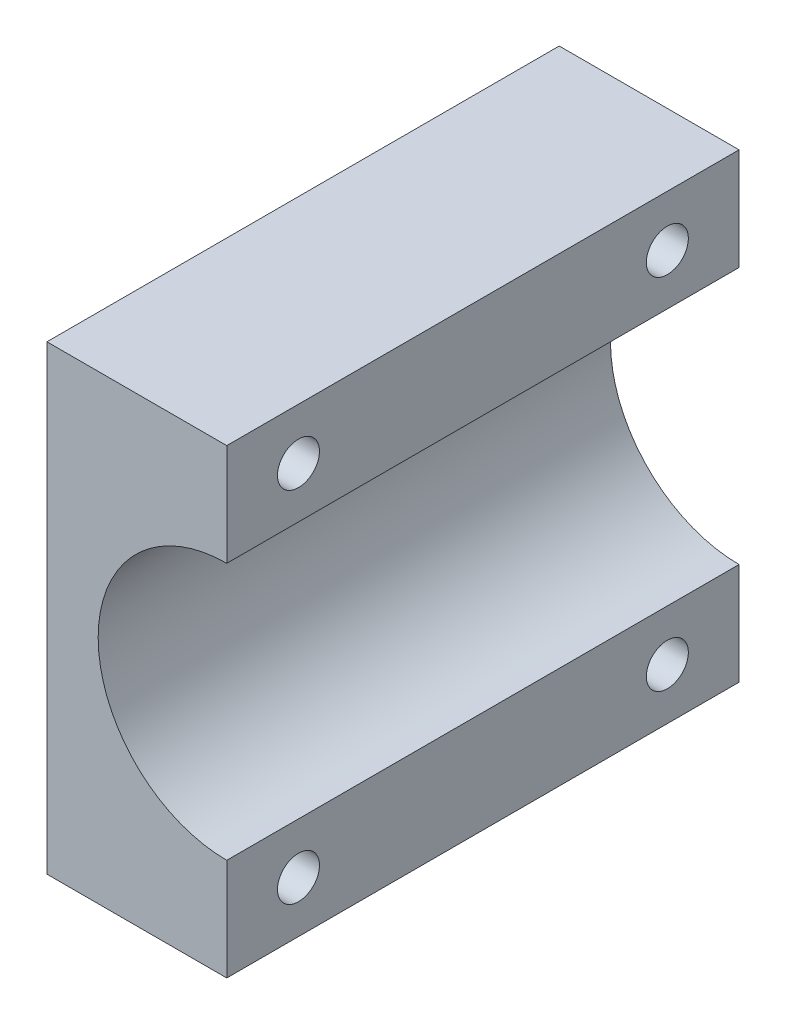
ISO-10303-21;
HEADER;
FILE_DESCRIPTION(('STEP AP214'),'2;1');
FILE_NAME('part.step','',(''),(''),'','','');
FILE_SCHEMA(('AUTOMOTIVE_DESIGN { 1 0 10303 214 1 1 1 1 }'));
ENDSEC;
DATA;
#1=APPLICATION_CONTEXT('core data for automotive mechanical design processes');
#2=APPLICATION_PROTOCOL_DEFINITION('international standard','automotive_design',2000,#1);
#3=PRODUCT_CONTEXT('',#1,'mechanical');
#4=PRODUCT('Part','Part','',(#3));
#5=PRODUCT_RELATED_PRODUCT_CATEGORY('part','',(#4));
#6=PRODUCT_DEFINITION_FORMATION('','',#4);
#7=PRODUCT_DEFINITION_CONTEXT('part definition',#1,'design');
#8=PRODUCT_DEFINITION('design','',#6,#7);
#9=PRODUCT_DEFINITION_SHAPE('','',#8);
#10=(LENGTH_UNIT() NAMED_UNIT(*) SI_UNIT(.MILLI.,.METRE.));
#11=(NAMED_UNIT(*) PLANE_ANGLE_UNIT() SI_UNIT($,.RADIAN.));
#12=(NAMED_UNIT(*) SI_UNIT($,.STERADIAN.) SOLID_ANGLE_UNIT());
#13=UNCERTAINTY_MEASURE_WITH_UNIT(LENGTH_MEASURE(1.E-05),#10,'distance_accuracy_value','');
#14=(GEOMETRIC_REPRESENTATION_CONTEXT(3) GLOBAL_UNCERTAINTY_ASSIGNED_CONTEXT((#13)) GLOBAL_UNIT_ASSIGNED_CONTEXT((#10,
#11,#12)) REPRESENTATION_CONTEXT('',''));
#15=CARTESIAN_POINT('',(0.,0.,0.));
#16=DIRECTION('',(0.,0.,1.));
#17=DIRECTION('',(1.,0.,0.));
#18=AXIS2_PLACEMENT_3D('',#15,#16,#17);
#19=CARTESIAN_POINT('',(-17.55,22.5,25.));
#20=DIRECTION('',(1.,0.,0.));
#21=DIRECTION('',(0.,1.,0.));
#22=AXIS2_PLACEMENT_3D('',#19,#20,#21);
#23=PLANE('',#22);
#24=CARTESIAN_POINT('',(-17.55,40.,-18.));
#25=DIRECTION('',(1.,0.,0.));
#26=DIRECTION('',(0.,0.,1.));
#27=AXIS2_PLACEMENT_3D('',#24,#25,#26);
#28=CIRCLE('',#27,2.05);
#29=CARTESIAN_POINT('',(-17.55,40.,-15.95));
#30=VERTEX_POINT('',#29);
#31=EDGE_CURVE('E132',#30,#30,#28,.T.);
#32=ORIENTED_EDGE('',*,*,#31,.T.);
#33=EDGE_LOOP('',(#32));
#34=FACE_BOUND('',#33,.T.);
#35=CARTESIAN_POINT('',(-17.55,40.,18.));
#36=DIRECTION('',(1.,0.,0.));
#37=DIRECTION('',(0.,0.,1.));
#38=AXIS2_PLACEMENT_3D('',#35,#36,#37);
#39=CIRCLE('',#38,2.05);
#40=CARTESIAN_POINT('',(-17.55,40.,20.05));
#41=VERTEX_POINT('',#40);
#42=EDGE_CURVE('E135',#41,#41,#39,.T.);
#43=ORIENTED_EDGE('',*,*,#42,.T.);
#44=EDGE_LOOP('',(#43));
#45=FACE_BOUND('',#44,.T.);
#46=CARTESIAN_POINT('',(-17.55,5.,-18.));
#47=DIRECTION('',(-1.,0.,0.));
#48=DIRECTION('',(0.,0.,1.));
#49=AXIS2_PLACEMENT_3D('',#46,#47,#48);
#50=CIRCLE('',#49,2.05);
#51=CARTESIAN_POINT('',(-17.55,5.,-15.95));
#52=VERTEX_POINT('',#51);
#53=EDGE_CURVE('E117',#52,#52,#50,.T.);
#54=ORIENTED_EDGE('',*,*,#53,.F.);
#55=EDGE_LOOP('',(#54));
#56=FACE_BOUND('',#55,.T.);
#57=CARTESIAN_POINT('',(-17.55,5.,18.));
#58=DIRECTION('',(-1.,0.,0.));
#59=DIRECTION('',(0.,0.,1.));
#60=AXIS2_PLACEMENT_3D('',#57,#58,#59);
#61=CIRCLE('',#60,2.05);
#62=CARTESIAN_POINT('',(-17.55,5.,20.05));
#63=VERTEX_POINT('',#62);
#64=EDGE_CURVE('E121',#63,#63,#61,.T.);
#65=ORIENTED_EDGE('',*,*,#64,.F.);
#66=EDGE_LOOP('',(#65));
#67=FACE_BOUND('',#66,.T.);
#68=DIRECTION('',(0.,-1.,0.));
#69=VECTOR('',#68,1.);
#70=CARTESIAN_POINT('',(-17.55,22.5,-25.));
#71=LINE('',#70,#69);
#72=CARTESIAN_POINT('',(-17.55,45.,-25.));
#73=VERTEX_POINT('',#72);
#74=CARTESIAN_POINT('',(-17.55,0.,-25.));
#75=VERTEX_POINT('',#74);
#76=EDGE_CURVE('E113',#73,#75,#71,.T.);
#77=ORIENTED_EDGE('',*,*,#76,.T.);
#78=DIRECTION('',(0.,0.,-1.));
#79=VECTOR('',#78,1.);
#80=CARTESIAN_POINT('',(-17.55,0.,25.));
#81=LINE('',#80,#79);
#82=CARTESIAN_POINT('',(-17.55,0.,25.));
#83=VERTEX_POINT('',#82);
#84=EDGE_CURVE('E11',#83,#75,#81,.T.);
#85=ORIENTED_EDGE('',*,*,#84,.F.);
#86=DIRECTION('',(0.,-1.,0.));
#87=VECTOR('',#86,1.);
#88=CARTESIAN_POINT('',(-17.55,22.5,25.));
#89=LINE('',#88,#87);
#90=CARTESIAN_POINT('',(-17.55,45.,25.));
#91=VERTEX_POINT('',#90);
#92=EDGE_CURVE('E108',#91,#83,#89,.T.);
#93=ORIENTED_EDGE('',*,*,#92,.F.);
#94=DIRECTION('',(0.,0.,-1.));
#95=VECTOR('',#94,1.);
#96=CARTESIAN_POINT('',(-17.55,45.,25.));
#97=LINE('',#96,#95);
#98=EDGE_CURVE('E124',#91,#73,#97,.T.);
#99=ORIENTED_EDGE('',*,*,#98,.T.);
#100=EDGE_LOOP('',(#77,#85,#93,#99));
#101=FACE_BOUND('',#100,.T.);
#102=ADVANCED_FACE('F35',(#34,#45,#56,#67,#101),#23,.F.);
#103=CARTESIAN_POINT('',(-17.55,0.,25.));
#104=DIRECTION('',(0.,1.,0.));
#105=DIRECTION('',(0.,0.,1.));
#106=AXIS2_PLACEMENT_3D('',#103,#104,#105);
#107=PLANE('',#106);
#108=DIRECTION('',(1.,0.,0.));
#109=VECTOR('',#108,1.);
#110=CARTESIAN_POINT('',(-17.55,0.,-25.));
#111=LINE('',#110,#109);
#112=CARTESIAN_POINT('',(0.,0.,-25.));
#113=VERTEX_POINT('',#112);
#114=EDGE_CURVE('E109',#75,#113,#111,.T.);
#115=ORIENTED_EDGE('',*,*,#114,.T.);
#116=DIRECTION('',(0.,0.,-1.));
#117=VECTOR('',#116,1.);
#118=CARTESIAN_POINT('',(0.,0.,-25.));
#119=LINE('',#118,#117);
#120=CARTESIAN_POINT('',(0.,0.,25.));
#121=VERTEX_POINT('',#120);
#122=EDGE_CURVE('E50',#121,#113,#119,.T.);
#123=ORIENTED_EDGE('',*,*,#122,.F.);
#124=DIRECTION('',(1.,0.,0.));
#125=VECTOR('',#124,1.);
#126=CARTESIAN_POINT('',(-17.55,0.,25.));
#127=LINE('',#126,#125);
#128=EDGE_CURVE('E111',#83,#121,#127,.T.);
#129=ORIENTED_EDGE('',*,*,#128,.F.);
#130=ORIENTED_EDGE('',*,*,#84,.T.);
#131=EDGE_LOOP('',(#115,#123,#129,#130));
#132=FACE_BOUND('',#131,.T.);
#133=ADVANCED_FACE('F167',(#132),#107,.F.);
#134=CARTESIAN_POINT('',(0.,22.5,25.));
#135=DIRECTION('',(0.,0.,-1.));
#136=DIRECTION('',(-1.,0.,0.));
#137=AXIS2_PLACEMENT_3D('',#134,#135,#136);
#138=CYLINDRICAL_SURFACE('',#137,12.55);
#139=CARTESIAN_POINT('',(0.,22.5,-25.));
#140=DIRECTION('',(0.,0.,-1.));
#141=DIRECTION('',(1.,0.,0.));
#142=AXIS2_PLACEMENT_3D('',#139,#140,#141);
#143=CIRCLE('',#142,12.55);
#144=CARTESIAN_POINT('',(0.,9.95000000000002,-25.));
#145=VERTEX_POINT('',#144);
#146=CARTESIAN_POINT('',(0.,35.05,-25.));
#147=VERTEX_POINT('',#146);
#148=EDGE_CURVE('E101',#145,#147,#143,.T.);
#149=ORIENTED_EDGE('',*,*,#148,.T.);
#150=DIRECTION('',(0.,0.,-1.));
#151=VECTOR('',#150,1.);
#152=CARTESIAN_POINT('',(0.,35.05,25.));
#153=LINE('',#152,#151);
#154=CARTESIAN_POINT('',(0.,35.05,25.));
#155=VERTEX_POINT('',#154);
#156=EDGE_CURVE('E138',#147,#155,#153,.F.);
#157=ORIENTED_EDGE('',*,*,#156,.T.);
#158=CARTESIAN_POINT('',(0.,22.5,25.));
#159=DIRECTION('',(0.,0.,-1.));
#160=DIRECTION('',(1.,0.,0.));
#161=AXIS2_PLACEMENT_3D('',#158,#159,#160);
#162=CIRCLE('',#161,12.55);
#163=CARTESIAN_POINT('',(0.,9.95000000000001,25.));
#164=VERTEX_POINT('',#163);
#165=EDGE_CURVE('E43',#164,#155,#162,.T.);
#166=ORIENTED_EDGE('',*,*,#165,.F.);
#167=DIRECTION('',(0.,0.,-1.));
#168=VECTOR('',#167,1.);
#169=CARTESIAN_POINT('',(0.,9.95000000000001,25.));
#170=LINE('',#169,#168);
#171=EDGE_CURVE('E88',#164,#145,#170,.T.);
#172=ORIENTED_EDGE('',*,*,#171,.T.);
#173=EDGE_LOOP('',(#149,#157,#166,#172));
#174=FACE_BOUND('',#173,.T.);
#175=ADVANCED_FACE('F99',(#174),#138,.F.);
#176=CARTESIAN_POINT('',(0.,22.5,25.));
#177=DIRECTION('',(0.,0.,1.));
#178=DIRECTION('',(1.,0.,0.));
#179=AXIS2_PLACEMENT_3D('',#176,#177,#178);
#180=PLANE('',#179);
#181=DIRECTION('',(0.,-1.,0.));
#182=VECTOR('',#181,1.);
#183=CARTESIAN_POINT('',(0.,22.5,25.));
#184=LINE('',#183,#182);
#185=CARTESIAN_POINT('',(0.,45.,25.));
#186=VERTEX_POINT('',#185);
#187=EDGE_CURVE('E103',#186,#155,#184,.T.);
#188=ORIENTED_EDGE('',*,*,#187,.F.);
#189=DIRECTION('',(1.,0.,0.));
#190=VECTOR('',#189,1.);
#191=CARTESIAN_POINT('',(-17.55,45.,25.));
#192=LINE('',#191,#190);
#193=EDGE_CURVE('E129',#91,#186,#192,.T.);
#194=ORIENTED_EDGE('',*,*,#193,.F.);
#195=ORIENTED_EDGE('',*,*,#92,.T.);
#196=ORIENTED_EDGE('',*,*,#128,.T.);
#197=EDGE_CURVE('E104',#164,#121,#184,.T.);
#198=ORIENTED_EDGE('',*,*,#197,.F.);
#199=ORIENTED_EDGE('',*,*,#165,.T.);
#200=EDGE_LOOP('',(#188,#194,#195,#196,#198,#199));
#201=FACE_BOUND('',#200,.T.);
#202=ADVANCED_FACE('F181',(#201),#180,.T.);
#203=CARTESIAN_POINT('',(0.,22.5,-25.));
#204=DIRECTION('',(0.,0.,1.));
#205=DIRECTION('',(1.,0.,0.));
#206=AXIS2_PLACEMENT_3D('',#203,#204,#205);
#207=PLANE('',#206);
#208=DIRECTION('',(1.,0.,0.));
#209=VECTOR('',#208,1.);
#210=CARTESIAN_POINT('',(-17.55,45.,-25.));
#211=LINE('',#210,#209);
#212=CARTESIAN_POINT('',(0.,45.,-25.));
#213=VERTEX_POINT('',#212);
#214=EDGE_CURVE('E130',#73,#213,#211,.T.);
#215=ORIENTED_EDGE('',*,*,#214,.T.);
#216=DIRECTION('',(0.,1.,0.));
#217=VECTOR('',#216,1.);
#218=CARTESIAN_POINT('',(0.,45.,-25.));
#219=LINE('',#218,#217);
#220=EDGE_CURVE('E58',#147,#213,#219,.T.);
#221=ORIENTED_EDGE('',*,*,#220,.F.);
#222=ORIENTED_EDGE('',*,*,#148,.F.);
#223=EDGE_CURVE('E85',#113,#145,#219,.T.);
#224=ORIENTED_EDGE('',*,*,#223,.F.);
#225=ORIENTED_EDGE('',*,*,#114,.F.);
#226=ORIENTED_EDGE('',*,*,#76,.F.);
#227=EDGE_LOOP('',(#215,#221,#222,#224,#225,#226));
#228=FACE_BOUND('',#227,.T.);
#229=ADVANCED_FACE('F107',(#228),#207,.F.);
#230=CARTESIAN_POINT('',(23.3482756057297,5.,18.));
#231=DIRECTION('',(-1.,0.,0.));
#232=DIRECTION('',(0.,0.,1.));
#233=AXIS2_PLACEMENT_3D('',#230,#231,#232);
#234=CYLINDRICAL_SURFACE('',#233,2.05);
#235=CARTESIAN_POINT('',(0.,5.,18.));
#236=DIRECTION('',(-1.,0.,0.));
#237=DIRECTION('',(0.,0.,1.));
#238=AXIS2_PLACEMENT_3D('',#235,#236,#237);
#239=CIRCLE('',#238,2.05);
#240=CARTESIAN_POINT('',(0.,5.,20.05));
#241=VERTEX_POINT('',#240);
#242=EDGE_CURVE('E143',#241,#241,#239,.F.);
#243=ORIENTED_EDGE('',*,*,#242,.T.);
#244=EDGE_LOOP('',(#243));
#245=FACE_BOUND('',#244,.T.);
#246=ORIENTED_EDGE('',*,*,#64,.T.);
#247=EDGE_LOOP('',(#246));
#248=FACE_BOUND('',#247,.T.);
#249=ADVANCED_FACE('F201',(#245,#248),#234,.F.);
#250=CARTESIAN_POINT('',(23.3482756057297,5.,-18.));
#251=DIRECTION('',(-1.,0.,0.));
#252=DIRECTION('',(0.,0.,1.));
#253=AXIS2_PLACEMENT_3D('',#250,#251,#252);
#254=CYLINDRICAL_SURFACE('',#253,2.05);
#255=CARTESIAN_POINT('',(0.,5.,-18.));
#256=DIRECTION('',(-1.,0.,0.));
#257=DIRECTION('',(0.,0.,1.));
#258=AXIS2_PLACEMENT_3D('',#255,#256,#257);
#259=CIRCLE('',#258,2.05);
#260=CARTESIAN_POINT('',(0.,5.,-15.95));
#261=VERTEX_POINT('',#260);
#262=EDGE_CURVE('E146',#261,#261,#259,.F.);
#263=ORIENTED_EDGE('',*,*,#262,.T.);
#264=EDGE_LOOP('',(#263));
#265=FACE_BOUND('',#264,.T.);
#266=ORIENTED_EDGE('',*,*,#53,.T.);
#267=EDGE_LOOP('',(#266));
#268=FACE_BOUND('',#267,.T.);
#269=ADVANCED_FACE('F198',(#265,#268),#254,.F.);
#270=CARTESIAN_POINT('',(-17.55,45.,25.));
#271=DIRECTION('',(0.,1.,0.));
#272=DIRECTION('',(0.,0.,1.));
#273=AXIS2_PLACEMENT_3D('',#270,#271,#272);
#274=PLANE('',#273);
#275=DIRECTION('',(0.,0.,1.));
#276=VECTOR('',#275,1.);
#277=CARTESIAN_POINT('',(0.,45.,-25.));
#278=LINE('',#277,#276);
#279=EDGE_CURVE('E94',#213,#186,#278,.T.);
#280=ORIENTED_EDGE('',*,*,#279,.F.);
#281=ORIENTED_EDGE('',*,*,#214,.F.);
#282=ORIENTED_EDGE('',*,*,#98,.F.);
#283=ORIENTED_EDGE('',*,*,#193,.T.);
#284=EDGE_LOOP('',(#280,#281,#282,#283));
#285=FACE_BOUND('',#284,.T.);
#286=ADVANCED_FACE('F184',(#285),#274,.T.);
#287=CARTESIAN_POINT('',(23.3482756057297,40.,18.));
#288=DIRECTION('',(-1.,0.,0.));
#289=DIRECTION('',(0.,0.,1.));
#290=AXIS2_PLACEMENT_3D('',#287,#288,#289);
#291=CYLINDRICAL_SURFACE('',#290,2.05);
#292=CARTESIAN_POINT('',(0.,40.,18.));
#293=DIRECTION('',(-1.,0.,0.));
#294=DIRECTION('',(0.,0.,1.));
#295=AXIS2_PLACEMENT_3D('',#292,#293,#294);
#296=CIRCLE('',#295,2.05);
#297=CARTESIAN_POINT('',(0.,40.,20.05));
#298=VERTEX_POINT('',#297);
#299=EDGE_CURVE('E149',#298,#298,#296,.T.);
#300=CARTESIAN_POINT('',(0.,40.,20.05));
#301=CARTESIAN_POINT('',(-0.182812499999996,40.,20.05));
#302=CARTESIAN_POINT('',(-0.365624999999996,40.,20.05));
#303=CARTESIAN_POINT('',(-0.731249999999996,40.,20.05));
#304=CARTESIAN_POINT('',(-0.914062499999996,40.,20.05));
#305=CARTESIAN_POINT('',(-1.2796875,40.,20.05));
#306=CARTESIAN_POINT('',(-1.4625,40.,20.05));
#307=CARTESIAN_POINT('',(-1.828125,40.,20.05));
#308=CARTESIAN_POINT('',(-2.0109375,40.,20.05));
#309=CARTESIAN_POINT('',(-2.3765625,40.,20.05));
#310=CARTESIAN_POINT('',(-2.559375,40.,20.05));
#311=CARTESIAN_POINT('',(-2.925,40.,20.05));
#312=CARTESIAN_POINT('',(-3.1078125,40.,20.05));
#313=CARTESIAN_POINT('',(-3.4734375,40.,20.05));
#314=CARTESIAN_POINT('',(-3.65625,40.,20.05));
#315=CARTESIAN_POINT('',(-4.021875,40.,20.05));
#316=CARTESIAN_POINT('',(-4.2046875,40.,20.05));
#317=CARTESIAN_POINT('',(-4.5703125,40.,20.05));
#318=CARTESIAN_POINT('',(-4.753125,40.,20.05));
#319=CARTESIAN_POINT('',(-5.11875,40.,20.05));
#320=CARTESIAN_POINT('',(-5.3015625,40.,20.05));
#321=CARTESIAN_POINT('',(-5.6671875,40.,20.05));
#322=CARTESIAN_POINT('',(-5.85,40.,20.05));
#323=CARTESIAN_POINT('',(-6.215625,40.,20.05));
#324=CARTESIAN_POINT('',(-6.3984375,40.,20.05));
#325=CARTESIAN_POINT('',(-6.7640625,40.,20.05));
#326=CARTESIAN_POINT('',(-6.946875,40.,20.05));
#327=CARTESIAN_POINT('',(-7.3125,40.,20.05));
#328=CARTESIAN_POINT('',(-7.4953125,40.,20.05));
#329=CARTESIAN_POINT('',(-7.8609375,40.,20.05));
#330=CARTESIAN_POINT('',(-8.04374999999999,40.,20.05));
#331=CARTESIAN_POINT('',(-8.40937499999999,40.,20.05));
#332=CARTESIAN_POINT('',(-8.59218749999999,40.,20.05));
#333=CARTESIAN_POINT('',(-8.95781249999999,40.,20.05));
#334=CARTESIAN_POINT('',(-9.14062499999999,40.,20.05));
#335=CARTESIAN_POINT('',(-9.50625,40.,20.05));
#336=CARTESIAN_POINT('',(-9.6890625,40.,20.05));
#337=CARTESIAN_POINT('',(-10.0546875,40.,20.05));
#338=CARTESIAN_POINT('',(-10.2375,40.,20.05));
#339=CARTESIAN_POINT('',(-10.603125,40.,20.05));
#340=CARTESIAN_POINT('',(-10.7859375,40.,20.05));
#341=CARTESIAN_POINT('',(-11.1515625,40.,20.05));
#342=CARTESIAN_POINT('',(-11.334375,40.,20.05));
#343=CARTESIAN_POINT('',(-11.7,40.,20.05));
#344=CARTESIAN_POINT('',(-11.8828125,40.,20.05));
#345=CARTESIAN_POINT('',(-12.2484375,40.,20.05));
#346=CARTESIAN_POINT('',(-12.43125,40.,20.05));
#347=CARTESIAN_POINT('',(-12.796875,40.,20.05));
#348=CARTESIAN_POINT('',(-12.9796875,40.,20.05));
#349=CARTESIAN_POINT('',(-13.3453125,40.,20.05));
#350=CARTESIAN_POINT('',(-13.528125,40.,20.05));
#351=CARTESIAN_POINT('',(-13.89375,40.,20.05));
#352=CARTESIAN_POINT('',(-14.0765625,40.,20.05));
#353=CARTESIAN_POINT('',(-14.4421875,40.,20.05));
#354=CARTESIAN_POINT('',(-14.625,40.,20.05));
#355=CARTESIAN_POINT('',(-14.990625,40.,20.05));
#356=CARTESIAN_POINT('',(-15.1734375,40.,20.05));
#357=CARTESIAN_POINT('',(-15.5390625,40.,20.05));
#358=CARTESIAN_POINT('',(-15.721875,40.,20.05));
#359=CARTESIAN_POINT('',(-16.0875,40.,20.05));
#360=CARTESIAN_POINT('',(-16.2703125,40.,20.05));
#361=CARTESIAN_POINT('',(-16.6359375,40.,20.05));
#362=CARTESIAN_POINT('',(-16.81875,40.,20.05));
#363=CARTESIAN_POINT('',(-17.184375,40.,20.05));
#364=CARTESIAN_POINT('',(-17.3671875,40.,20.05));
#365=CARTESIAN_POINT('',(-17.55,40.,20.05));
#366=B_SPLINE_CURVE_WITH_KNOTS('',3,(#300,#301,#302,#303,#304,#305,#306,#307,#308,#309,#310,
#311,#312,#313,#314,#315,#316,#317,#318,#319,#320,#321,#322,#323,#324,#325,#326,#327,#328,#329,
#330,#331,#332,#333,#334,#335,#336,#337,#338,#339,#340,#341,#342,#343,#344,#345,#346,#347,#348,
#349,#350,#351,#352,#353,#354,#355,#356,#357,#358,#359,#360,#361,#362,#363,#364,#365),
.UNSPECIFIED.,.F.,.F.,(4,2,2,2,2,2,2,2,2,2,2,2,2,2,2,2,2,2,2,2,2,2,2,2,2,2,2,2,2,2,2,2,4),(0.,
0.548437499999999,1.096875,1.6453125,2.19375,2.7421875,3.290625,3.8390625,4.3875,4.9359375,
5.484375,6.0328125,6.58125,7.1296875,7.678125,8.2265625,8.775,9.3234375,9.871875,10.4203125,
10.96875,11.5171875,12.065625,12.6140625,13.1625,13.7109375,14.259375,14.8078125,15.35625,
15.9046875,16.453125,17.0015625,17.55),.UNSPECIFIED.);
#367=EDGE_CURVE('BSEAM161',#298,#41,#366,.T.);
#368=ORIENTED_EDGE('',*,*,#299,.F.);
#369=ORIENTED_EDGE('',*,*,#42,.F.);
#370=ORIENTED_EDGE('',*,*,#367,.T.);
#371=ORIENTED_EDGE('',*,*,#367,.F.);
#372=EDGE_LOOP('',(#368,#370,#369,#371));
#373=FACE_BOUND('',#372,.T.);
#374=ADVANCED_FACE('F161',(#373),#291,.F.);
#375=CARTESIAN_POINT('',(23.3482756057297,40.,-18.));
#376=DIRECTION('',(-1.,0.,0.));
#377=DIRECTION('',(0.,0.,1.));
#378=AXIS2_PLACEMENT_3D('',#375,#376,#377);
#379=CYLINDRICAL_SURFACE('',#378,2.05);
#380=CARTESIAN_POINT('',(0.,40.,-18.));
#381=DIRECTION('',(-1.,0.,0.));
#382=DIRECTION('',(0.,0.,1.));
#383=AXIS2_PLACEMENT_3D('',#380,#381,#382);
#384=CIRCLE('',#383,2.05);
#385=CARTESIAN_POINT('',(0.,40.,-15.95));
#386=VERTEX_POINT('',#385);
#387=EDGE_CURVE('E38',#386,#386,#384,.T.);
#388=CARTESIAN_POINT('',(0.,40.,-15.95));
#389=CARTESIAN_POINT('',(-0.182812499999996,40.,-15.95));
#390=CARTESIAN_POINT('',(-0.365624999999996,40.,-15.95));
#391=CARTESIAN_POINT('',(-0.731249999999996,40.,-15.95));
#392=CARTESIAN_POINT('',(-0.914062499999996,40.,-15.95));
#393=CARTESIAN_POINT('',(-1.2796875,40.,-15.95));
#394=CARTESIAN_POINT('',(-1.4625,40.,-15.95));
#395=CARTESIAN_POINT('',(-1.828125,40.,-15.95));
#396=CARTESIAN_POINT('',(-2.0109375,40.,-15.95));
#397=CARTESIAN_POINT('',(-2.3765625,40.,-15.95));
#398=CARTESIAN_POINT('',(-2.559375,40.,-15.95));
#399=CARTESIAN_POINT('',(-2.925,40.,-15.95));
#400=CARTESIAN_POINT('',(-3.1078125,40.,-15.95));
#401=CARTESIAN_POINT('',(-3.4734375,40.,-15.95));
#402=CARTESIAN_POINT('',(-3.65625,40.,-15.95));
#403=CARTESIAN_POINT('',(-4.021875,40.,-15.95));
#404=CARTESIAN_POINT('',(-4.2046875,40.,-15.95));
#405=CARTESIAN_POINT('',(-4.5703125,40.,-15.95));
#406=CARTESIAN_POINT('',(-4.753125,40.,-15.95));
#407=CARTESIAN_POINT('',(-5.11875,40.,-15.95));
#408=CARTESIAN_POINT('',(-5.3015625,40.,-15.95));
#409=CARTESIAN_POINT('',(-5.6671875,40.,-15.95));
#410=CARTESIAN_POINT('',(-5.85,40.,-15.95));
#411=CARTESIAN_POINT('',(-6.215625,40.,-15.95));
#412=CARTESIAN_POINT('',(-6.3984375,40.,-15.95));
#413=CARTESIAN_POINT('',(-6.7640625,40.,-15.95));
#414=CARTESIAN_POINT('',(-6.946875,40.,-15.95));
#415=CARTESIAN_POINT('',(-7.3125,40.,-15.95));
#416=CARTESIAN_POINT('',(-7.4953125,40.,-15.95));
#417=CARTESIAN_POINT('',(-7.8609375,40.,-15.95));
#418=CARTESIAN_POINT('',(-8.04374999999999,40.,-15.95));
#419=CARTESIAN_POINT('',(-8.40937499999999,40.,-15.95));
#420=CARTESIAN_POINT('',(-8.59218749999999,40.,-15.95));
#421=CARTESIAN_POINT('',(-8.95781249999999,40.,-15.95));
#422=CARTESIAN_POINT('',(-9.14062499999999,40.,-15.95));
#423=CARTESIAN_POINT('',(-9.50625,40.,-15.95));
#424=CARTESIAN_POINT('',(-9.6890625,40.,-15.95));
#425=CARTESIAN_POINT('',(-10.0546875,40.,-15.95));
#426=CARTESIAN_POINT('',(-10.2375,40.,-15.95));
#427=CARTESIAN_POINT('',(-10.603125,40.,-15.95));
#428=CARTESIAN_POINT('',(-10.7859375,40.,-15.95));
#429=CARTESIAN_POINT('',(-11.1515625,40.,-15.95));
#430=CARTESIAN_POINT('',(-11.334375,40.,-15.95));
#431=CARTESIAN_POINT('',(-11.7,40.,-15.95));
#432=CARTESIAN_POINT('',(-11.8828125,40.,-15.95));
#433=CARTESIAN_POINT('',(-12.2484375,40.,-15.95));
#434=CARTESIAN_POINT('',(-12.43125,40.,-15.95));
#435=CARTESIAN_POINT('',(-12.796875,40.,-15.95));
#436=CARTESIAN_POINT('',(-12.9796875,40.,-15.95));
#437=CARTESIAN_POINT('',(-13.3453125,40.,-15.95));
#438=CARTESIAN_POINT('',(-13.528125,40.,-15.95));
#439=CARTESIAN_POINT('',(-13.89375,40.,-15.95));
#440=CARTESIAN_POINT('',(-14.0765625,40.,-15.95));
#441=CARTESIAN_POINT('',(-14.4421875,40.,-15.95));
#442=CARTESIAN_POINT('',(-14.625,40.,-15.95));
#443=CARTESIAN_POINT('',(-14.990625,40.,-15.95));
#444=CARTESIAN_POINT('',(-15.1734375,40.,-15.95));
#445=CARTESIAN_POINT('',(-15.5390625,40.,-15.95));
#446=CARTESIAN_POINT('',(-15.721875,40.,-15.95));
#447=CARTESIAN_POINT('',(-16.0875,40.,-15.95));
#448=CARTESIAN_POINT('',(-16.2703125,40.,-15.95));
#449=CARTESIAN_POINT('',(-16.6359375,40.,-15.95));
#450=CARTESIAN_POINT('',(-16.81875,40.,-15.95));
#451=CARTESIAN_POINT('',(-17.184375,40.,-15.95));
#452=CARTESIAN_POINT('',(-17.3671875,40.,-15.95));
#453=CARTESIAN_POINT('',(-17.55,40.,-15.95));
#454=B_SPLINE_CURVE_WITH_KNOTS('',3,(#388,#389,#390,#391,#392,#393,#394,#395,#396,#397,#398,
#399,#400,#401,#402,#403,#404,#405,#406,#407,#408,#409,#410,#411,#412,#413,#414,#415,#416,#417,
#418,#419,#420,#421,#422,#423,#424,#425,#426,#427,#428,#429,#430,#431,#432,#433,#434,#435,#436,
#437,#438,#439,#440,#441,#442,#443,#444,#445,#446,#447,#448,#449,#450,#451,#452,#453),
.UNSPECIFIED.,.F.,.F.,(4,2,2,2,2,2,2,2,2,2,2,2,2,2,2,2,2,2,2,2,2,2,2,2,2,2,2,2,2,2,2,2,4),(0.,
0.548437499999999,1.096875,1.6453125,2.19375,2.7421875,3.290625,3.8390625,4.3875,4.9359375,
5.484375,6.0328125,6.58125,7.1296875,7.678125,8.2265625,8.775,9.3234375,9.871875,10.4203125,
10.96875,11.5171875,12.065625,12.6140625,13.1625,13.7109375,14.259375,14.8078125,15.35625,
15.9046875,16.453125,17.0015625,17.55),.UNSPECIFIED.);
#455=EDGE_CURVE('BSEAM158',#386,#30,#454,.T.);
#456=ORIENTED_EDGE('',*,*,#387,.F.);
#457=ORIENTED_EDGE('',*,*,#31,.F.);
#458=ORIENTED_EDGE('',*,*,#455,.T.);
#459=ORIENTED_EDGE('',*,*,#455,.F.);
#460=EDGE_LOOP('',(#456,#458,#457,#459));
#461=FACE_BOUND('',#460,.T.);
#462=ADVANCED_FACE('F158',(#461),#379,.F.);
#463=CARTESIAN_POINT('',(0.,0.,0.));
#464=DIRECTION('',(-1.,0.,0.));
#465=DIRECTION('',(0.,0.,1.));
#466=AXIS2_PLACEMENT_3D('',#463,#464,#465);
#467=PLANE('',#466);
#468=ORIENTED_EDGE('',*,*,#299,.T.);
#469=EDGE_LOOP('',(#468));
#470=FACE_BOUND('',#469,.T.);
#471=ORIENTED_EDGE('',*,*,#387,.T.);
#472=EDGE_LOOP('',(#471));
#473=FACE_BOUND('',#472,.T.);
#474=ORIENTED_EDGE('',*,*,#220,.T.);
#475=ORIENTED_EDGE('',*,*,#279,.T.);
#476=ORIENTED_EDGE('',*,*,#187,.T.);
#477=ORIENTED_EDGE('',*,*,#156,.F.);
#478=EDGE_LOOP('',(#474,#475,#476,#477));
#479=FACE_BOUND('',#478,.T.);
#480=ADVANCED_FACE('F156',(#470,#473,#479),#467,.F.);
#481=ORIENTED_EDGE('',*,*,#242,.F.);
#482=EDGE_LOOP('',(#481));
#483=FACE_BOUND('',#482,.T.);
#484=ORIENTED_EDGE('',*,*,#262,.F.);
#485=EDGE_LOOP('',(#484));
#486=FACE_BOUND('',#485,.T.);
#487=ORIENTED_EDGE('',*,*,#197,.T.);
#488=ORIENTED_EDGE('',*,*,#122,.T.);
#489=ORIENTED_EDGE('',*,*,#223,.T.);
#490=ORIENTED_EDGE('',*,*,#171,.F.);
#491=EDGE_LOOP('',(#487,#488,#489,#490));
#492=FACE_BOUND('',#491,.T.);
#493=ADVANCED_FACE('F87',(#483,#486,#492),#467,.F.);
#494=CLOSED_SHELL('',(#102,#133,#175,#202,#229,#249,#269,#286,#374,#462,#480,#493));
#495=MANIFOLD_SOLID_BREP('B2',#494);
#496=ADVANCED_BREP_SHAPE_REPRESENTATION('',(#18,#495),#14);
#497=SHAPE_DEFINITION_REPRESENTATION(#9,#496);
ENDSEC;
END-ISO-10303-21;
